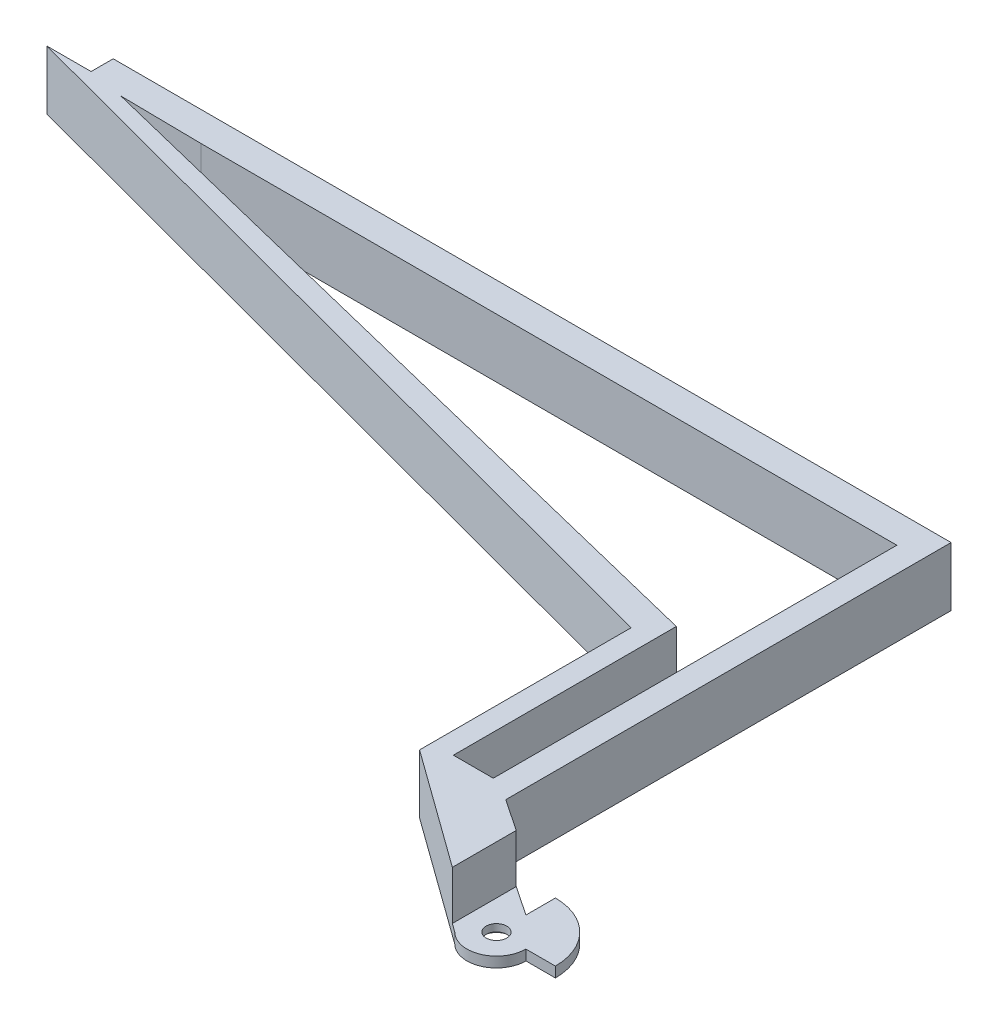
ISO-10303-21;
HEADER;
FILE_DESCRIPTION(('STEP AP214'),'2;1');
FILE_NAME('part.step','',(''),(''),'','','');
FILE_SCHEMA(('AUTOMOTIVE_DESIGN { 1 0 10303 214 1 1 1 1 }'));
ENDSEC;
DATA;
#1=APPLICATION_CONTEXT('core data for automotive mechanical design processes');
#2=APPLICATION_PROTOCOL_DEFINITION('international standard','automotive_design',2000,#1);
#3=PRODUCT_CONTEXT('',#1,'mechanical');
#4=PRODUCT('Part','Part','',(#3));
#5=PRODUCT_RELATED_PRODUCT_CATEGORY('part','',(#4));
#6=PRODUCT_DEFINITION_FORMATION('','',#4);
#7=PRODUCT_DEFINITION_CONTEXT('part definition',#1,'design');
#8=PRODUCT_DEFINITION('design','',#6,#7);
#9=PRODUCT_DEFINITION_SHAPE('','',#8);
#10=(LENGTH_UNIT() NAMED_UNIT(*) SI_UNIT(.MILLI.,.METRE.));
#11=(NAMED_UNIT(*) PLANE_ANGLE_UNIT() SI_UNIT($,.RADIAN.));
#12=(NAMED_UNIT(*) SI_UNIT($,.STERADIAN.) SOLID_ANGLE_UNIT());
#13=UNCERTAINTY_MEASURE_WITH_UNIT(LENGTH_MEASURE(1.E-05),#10,'distance_accuracy_value','');
#14=(GEOMETRIC_REPRESENTATION_CONTEXT(3) GLOBAL_UNCERTAINTY_ASSIGNED_CONTEXT((#13)) GLOBAL_UNIT_ASSIGNED_CONTEXT((#10,
#11,#12)) REPRESENTATION_CONTEXT('',''));
#15=CARTESIAN_POINT('',(0.,0.,0.));
#16=DIRECTION('',(0.,0.,1.));
#17=DIRECTION('',(1.,0.,0.));
#18=AXIS2_PLACEMENT_3D('',#15,#16,#17);
#19=CARTESIAN_POINT('',(0.,0.,0.));
#20=DIRECTION('',(0.,1.,0.));
#21=DIRECTION('',(0.,0.,1.));
#22=AXIS2_PLACEMENT_3D('',#19,#20,#21);
#23=PLANE('',#22);
#24=DIRECTION('',(0.,0.,1.));
#25=VECTOR('',#24,1.);
#26=CARTESIAN_POINT('',(-21.722634255886,0.,0.));
#27=LINE('',#26,#25);
#28=CARTESIAN_POINT('',(-21.722634255886,0.,-52.724086510522));
#29=VERTEX_POINT('',#28);
#30=CARTESIAN_POINT('',(-21.722634255886,0.,-14.302803384287));
#31=VERTEX_POINT('',#30);
#32=EDGE_CURVE('E241',#29,#31,#27,.T.);
#33=ORIENTED_EDGE('',*,*,#32,.T.);
#34=DIRECTION('',(1.,0.,0.));
#35=VECTOR('',#34,1.);
#36=CARTESIAN_POINT('',(0.,0.,-14.302803384287));
#37=LINE('',#36,#35);
#38=CARTESIAN_POINT('',(-14.8463419737858,0.,-14.302803384287));
#39=VERTEX_POINT('',#38);
#40=EDGE_CURVE('E220',#31,#39,#37,.T.);
#41=ORIENTED_EDGE('',*,*,#40,.T.);
#42=DIRECTION('',(0.,0.,-1.));
#43=VECTOR('',#42,1.);
#44=CARTESIAN_POINT('',(-14.8463419737858,0.,0.));
#45=LINE('',#44,#43);
#46=CARTESIAN_POINT('',(-14.8463419737858,0.,-83.8457667411095));
#47=VERTEX_POINT('',#46);
#48=EDGE_CURVE('E224',#39,#47,#45,.T.);
#49=ORIENTED_EDGE('',*,*,#48,.T.);
#50=DIRECTION('',(-1.,0.,0.));
#51=VECTOR('',#50,1.);
#52=CARTESIAN_POINT('',(0.,0.,-83.8457667411095));
#53=LINE('',#52,#51);
#54=CARTESIAN_POINT('',(-134.751688642909,0.,-83.8457667411095));
#55=VERTEX_POINT('',#54);
#56=EDGE_CURVE('E229',#47,#55,#53,.T.);
#57=ORIENTED_EDGE('',*,*,#56,.T.);
#58=DIRECTION('',(-0.999911696276324,0.,-0.0132890800962312));
#59=VECTOR('',#58,1.);
#60=CARTESIAN_POINT('',(1.09033761799503,0.,-82.0403917523599));
#61=LINE('',#60,#59);
#62=CARTESIAN_POINT('',(-148.742405448219,0.,-84.0317069165488));
#63=VERTEX_POINT('',#62);
#64=EDGE_CURVE('E233',#55,#63,#61,.T.);
#65=ORIENTED_EDGE('',*,*,#64,.T.);
#66=DIRECTION('',(0.970941713271439,0.,0.239316086859038));
#67=VECTOR('',#66,1.);
#68=CARTESIAN_POINT('',(11.0069698572224,0.,-44.6569485209475));
#69=LINE('',#68,#67);
#70=EDGE_CURVE('E237',#63,#29,#69,.T.);
#71=ORIENTED_EDGE('',*,*,#70,.T.);
#72=EDGE_LOOP('',(#33,#41,#49,#57,#65,#71));
#73=FACE_BOUND('',#72,.T.);
#74=DIRECTION('',(0.966424495370872,0.,0.256950763274125));
#75=VECTOR('',#74,1.);
#76=CARTESIAN_POINT('',(-25.4257667411095,0.,-48.6479755587739));
#77=LINE('',#76,#75);
#78=CARTESIAN_POINT('',(-162.585766741109,0.,-85.1157667411095));
#79=VERTEX_POINT('',#78);
#80=CARTESIAN_POINT('',(-25.4257667411095,0.,-48.6479755587739));
#81=VERTEX_POINT('',#80);
#82=EDGE_CURVE('E289',#79,#81,#77,.T.);
#83=ORIENTED_EDGE('',*,*,#82,.F.);
#84=DIRECTION('',(-1.,0.,0.));
#85=VECTOR('',#84,1.);
#86=CARTESIAN_POINT('',(-162.585766741109,0.,-85.1157667411095));
#87=LINE('',#86,#85);
#88=CARTESIAN_POINT('',(-154.965766741109,0.,-85.1157667411095));
#89=VERTEX_POINT('',#88);
#90=EDGE_CURVE('E298',#89,#79,#87,.T.);
#91=ORIENTED_EDGE('',*,*,#90,.F.);
#92=DIRECTION('',(0.,0.,1.));
#93=VECTOR('',#92,1.);
#94=CARTESIAN_POINT('',(-154.965766741109,0.,-85.1157667411095));
#95=LINE('',#94,#93);
#96=CARTESIAN_POINT('',(-154.965766741109,0.,-88.9257667411095));
#97=VERTEX_POINT('',#96);
#98=EDGE_CURVE('E355',#97,#89,#95,.T.);
#99=ORIENTED_EDGE('',*,*,#98,.F.);
#100=DIRECTION('',(-1.,0.,0.));
#101=VECTOR('',#100,1.);
#102=CARTESIAN_POINT('',(-154.965766741109,0.,-88.9257667411095));
#103=LINE('',#102,#101);
#104=CARTESIAN_POINT('',(-10.5729282133232,0.,-88.9257667411095));
#105=VERTEX_POINT('',#104);
#106=EDGE_CURVE('E352',#105,#97,#103,.T.);
#107=ORIENTED_EDGE('',*,*,#106,.F.);
#108=DIRECTION('',(0.,0.,-1.));
#109=VECTOR('',#108,1.);
#110=CARTESIAN_POINT('',(-10.5729282133232,0.,-12.1801843764384));
#111=LINE('',#110,#109);
#112=CARTESIAN_POINT('',(-10.5729282133232,0.,-12.1801843764384));
#113=VERTEX_POINT('',#112);
#114=EDGE_CURVE('E348',#113,#105,#111,.T.);
#115=ORIENTED_EDGE('',*,*,#114,.F.);
#116=DIRECTION('',(-0.830176857864615,0.,-0.5575001207767));
#117=VECTOR('',#116,1.);
#118=CARTESIAN_POINT('',(0.,0.,-5.08));
#119=LINE('',#118,#117);
#120=CARTESIAN_POINT('',(0.,0.,-5.08));
#121=VERTEX_POINT('',#120);
#122=EDGE_CURVE('E345',#121,#113,#119,.T.);
#123=ORIENTED_EDGE('',*,*,#122,.F.);
#124=DIRECTION('',(0.,0.,1.));
#125=VECTOR('',#124,1.);
#126=CARTESIAN_POINT('',(0.,0.,-5.08));
#127=LINE('',#126,#125);
#128=CARTESIAN_POINT('',(0.,0.,-10.16));
#129=VERTEX_POINT('',#128);
#130=EDGE_CURVE('E341',#129,#121,#127,.T.);
#131=ORIENTED_EDGE('',*,*,#130,.F.);
#132=CARTESIAN_POINT('',(0.,0.,0.));
#133=DIRECTION('',(0.,1.,0.));
#134=DIRECTION('',(0.,0.,1.));
#135=AXIS2_PLACEMENT_3D('',#132,#133,#134);
#136=CIRCLE('',#135,10.16);
#137=CARTESIAN_POINT('',(10.16,0.,0.));
#138=VERTEX_POINT('',#137);
#139=EDGE_CURVE('E337',#138,#129,#136,.T.);
#140=ORIENTED_EDGE('',*,*,#139,.F.);
#141=DIRECTION('',(1.,0.,0.));
#142=VECTOR('',#141,1.);
#143=CARTESIAN_POINT('',(5.08,0.,0.));
#144=LINE('',#143,#142);
#145=CARTESIAN_POINT('',(5.08,0.,0.));
#146=VERTEX_POINT('',#145);
#147=EDGE_CURVE('E333',#146,#138,#144,.T.);
#148=ORIENTED_EDGE('',*,*,#147,.F.);
#149=CARTESIAN_POINT('',(0.,0.,0.));
#150=DIRECTION('',(0.,1.,0.));
#151=DIRECTION('',(0.,0.,1.));
#152=AXIS2_PLACEMENT_3D('',#149,#150,#151);
#153=CIRCLE('',#152,5.08);
#154=CARTESIAN_POINT('',(-3.59210244842768,0.,3.59210244842764));
#155=VERTEX_POINT('',#154);
#156=EDGE_CURVE('E329',#155,#146,#153,.T.);
#157=ORIENTED_EDGE('',*,*,#156,.F.);
#158=DIRECTION('',(0.810617030445156,0.,0.585576664453321));
#159=VECTOR('',#158,1.);
#160=CARTESIAN_POINT('',(-3.59210244842768,0.,3.59210244842764));
#161=LINE('',#160,#159);
#162=CARTESIAN_POINT('',(-25.4257667411095,0.,-12.1801843764384));
#163=VERTEX_POINT('',#162);
#164=EDGE_CURVE('E326',#163,#155,#161,.T.);
#165=ORIENTED_EDGE('',*,*,#164,.F.);
#166=DIRECTION('',(0.,0.,1.));
#167=VECTOR('',#166,1.);
#168=CARTESIAN_POINT('',(-25.4257667411095,0.,-12.1801843764384));
#169=LINE('',#168,#167);
#170=EDGE_CURVE('E323',#81,#163,#169,.T.);
#171=ORIENTED_EDGE('',*,*,#170,.F.);
#172=EDGE_LOOP('',(#83,#91,#99,#107,#115,#123,#131,#140,#148,#157,#165,#171));
#173=FACE_BOUND('',#172,.T.);
#174=CARTESIAN_POINT('',(0.,0.,0.));
#175=DIRECTION('',(0.,-1.,0.));
#176=DIRECTION('',(0.,0.,-1.));
#177=AXIS2_PLACEMENT_3D('',#174,#175,#176);
#178=CIRCLE('',#177,2.421001);
#179=CARTESIAN_POINT('',(0.,0.,-2.421001));
#180=VERTEX_POINT('',#179);
#181=EDGE_CURVE('E189',#180,#180,#178,.T.);
#182=ORIENTED_EDGE('',*,*,#181,.F.);
#183=EDGE_LOOP('',(#182));
#184=FACE_BOUND('',#183,.T.);
#185=ADVANCED_FACE('F41',(#73,#173,#184),#23,.F.);
#186=CARTESIAN_POINT('',(-25.4257667411095,10.16,-48.6479755587739));
#187=DIRECTION('',(0.256950763274125,0.,-0.966424495370872));
#188=DIRECTION('',(-0.966424495370872,0.,-0.256950763274125));
#189=AXIS2_PLACEMENT_3D('',#186,#187,#188);
#190=PLANE('',#189);
#191=ORIENTED_EDGE('',*,*,#82,.T.);
#192=DIRECTION('',(0.,-1.,0.));
#193=VECTOR('',#192,1.);
#194=CARTESIAN_POINT('',(-25.4257667411095,10.16,-48.6479755587739));
#195=LINE('',#194,#193);
#196=CARTESIAN_POINT('',(-25.4257667411095,10.16,-48.6479755587739));
#197=VERTEX_POINT('',#196);
#198=EDGE_CURVE('E11',#197,#81,#195,.T.);
#199=ORIENTED_EDGE('',*,*,#198,.F.);
#200=DIRECTION('',(0.966424495370872,0.,0.256950763274125));
#201=VECTOR('',#200,1.);
#202=CARTESIAN_POINT('',(-25.4257667411095,10.16,-48.6479755587739));
#203=LINE('',#202,#201);
#204=CARTESIAN_POINT('',(-162.585766741109,10.16,-85.1157667411095));
#205=VERTEX_POINT('',#204);
#206=EDGE_CURVE('E293',#205,#197,#203,.T.);
#207=ORIENTED_EDGE('',*,*,#206,.F.);
#208=DIRECTION('',(0.,-1.,0.));
#209=VECTOR('',#208,1.);
#210=CARTESIAN_POINT('',(-162.585766741109,10.16,-85.1157667411095));
#211=LINE('',#210,#209);
#212=EDGE_CURVE('E319',#205,#79,#211,.T.);
#213=ORIENTED_EDGE('',*,*,#212,.T.);
#214=EDGE_LOOP('',(#191,#199,#207,#213));
#215=FACE_BOUND('',#214,.T.);
#216=ADVANCED_FACE('F43',(#215),#190,.F.);
#217=CARTESIAN_POINT('',(-25.4257667411095,10.16,-12.1801843764384));
#218=DIRECTION('',(1.,0.,0.));
#219=DIRECTION('',(0.,0.,-1.));
#220=AXIS2_PLACEMENT_3D('',#217,#218,#219);
#221=PLANE('',#220);
#222=ORIENTED_EDGE('',*,*,#170,.T.);
#223=DIRECTION('',(0.,-1.,0.));
#224=VECTOR('',#223,1.);
#225=CARTESIAN_POINT('',(-25.4257667411095,10.16,-12.1801843764384));
#226=LINE('',#225,#224);
#227=CARTESIAN_POINT('',(-25.4257667411095,10.16,-12.1801843764384));
#228=VERTEX_POINT('',#227);
#229=EDGE_CURVE('E51',#228,#163,#226,.T.);
#230=ORIENTED_EDGE('',*,*,#229,.F.);
#231=DIRECTION('',(0.,0.,1.));
#232=VECTOR('',#231,1.);
#233=CARTESIAN_POINT('',(-25.4257667411095,10.16,-12.1801843764384));
#234=LINE('',#233,#232);
#235=EDGE_CURVE('E297',#197,#228,#234,.T.);
#236=ORIENTED_EDGE('',*,*,#235,.F.);
#237=ORIENTED_EDGE('',*,*,#198,.T.);
#238=EDGE_LOOP('',(#222,#230,#236,#237));
#239=FACE_BOUND('',#238,.T.);
#240=ADVANCED_FACE('F447',(#239),#221,.F.);
#241=CARTESIAN_POINT('',(-3.59210244842768,10.16,3.59210244842764));
#242=DIRECTION('',(0.585576664453321,0.,-0.810617030445156));
#243=DIRECTION('',(-0.810617030445156,0.,-0.585576664453321));
#244=AXIS2_PLACEMENT_3D('',#241,#242,#243);
#245=PLANE('',#244);
#246=DIRECTION('',(-0.810617030445156,0.,-0.585576664453321));
#247=VECTOR('',#246,1.);
#248=CARTESIAN_POINT('',(-3.59210244842768,1.778,3.59210244842764));
#249=LINE('',#248,#247);
#250=CARTESIAN_POINT('',(-3.59210244842768,1.778,3.59210244842764));
#251=VERTEX_POINT('',#250);
#252=CARTESIAN_POINT('',(-5.08,1.778,2.51726926262656));
#253=VERTEX_POINT('',#252);
#254=EDGE_CURVE('E193',#251,#253,#249,.T.);
#255=ORIENTED_EDGE('',*,*,#254,.T.);
#256=DIRECTION('',(0.,1.,0.));
#257=VECTOR('',#256,1.);
#258=CARTESIAN_POINT('',(-5.08,10.16,2.51726926262656));
#259=LINE('',#258,#257);
#260=CARTESIAN_POINT('',(-5.08,10.16,2.51726926262656));
#261=VERTEX_POINT('',#260);
#262=EDGE_CURVE('E179',#253,#261,#259,.T.);
#263=ORIENTED_EDGE('',*,*,#262,.T.);
#264=DIRECTION('',(0.810617030445156,0.,0.585576664453321));
#265=VECTOR('',#264,1.);
#266=CARTESIAN_POINT('',(-3.59210244842768,10.16,3.59210244842764));
#267=LINE('',#266,#265);
#268=EDGE_CURVE('E301',#228,#261,#267,.T.);
#269=ORIENTED_EDGE('',*,*,#268,.F.);
#270=ORIENTED_EDGE('',*,*,#229,.T.);
#271=ORIENTED_EDGE('',*,*,#164,.T.);
#272=DIRECTION('',(0.,-1.,0.));
#273=VECTOR('',#272,1.);
#274=CARTESIAN_POINT('',(-3.59210244842768,10.16,3.59210244842764));
#275=LINE('',#274,#273);
#276=EDGE_CURVE('E202',#251,#155,#275,.T.);
#277=ORIENTED_EDGE('',*,*,#276,.F.);
#278=EDGE_LOOP('',(#255,#263,#269,#270,#271,#277));
#279=FACE_BOUND('',#278,.T.);
#280=ADVANCED_FACE('F200',(#279),#245,.F.);
#281=CARTESIAN_POINT('',(0.,10.16,0.));
#282=DIRECTION('',(0.,-1.,0.));
#283=DIRECTION('',(0.,0.,-1.));
#284=AXIS2_PLACEMENT_3D('',#281,#282,#283);
#285=CYLINDRICAL_SURFACE('',#284,5.08);
#286=DIRECTION('',(0.,-1.,0.));
#287=VECTOR('',#286,1.);
#288=CARTESIAN_POINT('',(5.08,10.16,0.));
#289=LINE('',#288,#287);
#290=CARTESIAN_POINT('',(5.08,1.778,0.));
#291=VERTEX_POINT('',#290);
#292=EDGE_CURVE('E388',#291,#146,#289,.T.);
#293=ORIENTED_EDGE('',*,*,#292,.F.);
#294=CARTESIAN_POINT('',(0.,1.778,0.));
#295=DIRECTION('',(0.,-1.,0.));
#296=DIRECTION('',(0.,0.,-1.));
#297=AXIS2_PLACEMENT_3D('',#294,#295,#296);
#298=CIRCLE('',#297,5.08);
#299=EDGE_CURVE('E204',#291,#251,#298,.T.);
#300=ORIENTED_EDGE('',*,*,#299,.T.);
#301=ORIENTED_EDGE('',*,*,#276,.T.);
#302=ORIENTED_EDGE('',*,*,#156,.T.);
#303=EDGE_LOOP('',(#293,#300,#301,#302));
#304=FACE_BOUND('',#303,.T.);
#305=ADVANCED_FACE('F406',(#304),#285,.T.);
#306=CARTESIAN_POINT('',(5.08,10.16,0.));
#307=DIRECTION('',(0.,0.,-1.));
#308=DIRECTION('',(-1.,0.,0.));
#309=AXIS2_PLACEMENT_3D('',#306,#307,#308);
#310=PLANE('',#309);
#311=DIRECTION('',(0.,-1.,0.));
#312=VECTOR('',#311,1.);
#313=CARTESIAN_POINT('',(10.16,10.16,0.));
#314=LINE('',#313,#312);
#315=CARTESIAN_POINT('',(10.16,1.778,0.));
#316=VERTEX_POINT('',#315);
#317=EDGE_CURVE('E385',#316,#138,#314,.T.);
#318=ORIENTED_EDGE('',*,*,#317,.F.);
#319=DIRECTION('',(-1.,0.,0.));
#320=VECTOR('',#319,1.);
#321=CARTESIAN_POINT('',(5.08,1.778,0.));
#322=LINE('',#321,#320);
#323=EDGE_CURVE('E209',#316,#291,#322,.T.);
#324=ORIENTED_EDGE('',*,*,#323,.T.);
#325=ORIENTED_EDGE('',*,*,#292,.T.);
#326=ORIENTED_EDGE('',*,*,#147,.T.);
#327=EDGE_LOOP('',(#318,#324,#325,#326));
#328=FACE_BOUND('',#327,.T.);
#329=ADVANCED_FACE('F411',(#328),#310,.F.);
#330=CARTESIAN_POINT('',(0.,10.16,0.));
#331=DIRECTION('',(0.,-1.,0.));
#332=DIRECTION('',(0.,0.,-1.));
#333=AXIS2_PLACEMENT_3D('',#330,#331,#332);
#334=CYLINDRICAL_SURFACE('',#333,10.16);
#335=DIRECTION('',(0.,-1.,0.));
#336=VECTOR('',#335,1.);
#337=CARTESIAN_POINT('',(0.,10.16,-10.16));
#338=LINE('',#337,#336);
#339=CARTESIAN_POINT('',(0.,1.778,-10.16));
#340=VERTEX_POINT('',#339);
#341=EDGE_CURVE('E382',#340,#129,#338,.T.);
#342=ORIENTED_EDGE('',*,*,#341,.F.);
#343=CARTESIAN_POINT('',(0.,1.778,0.));
#344=DIRECTION('',(0.,-1.,0.));
#345=DIRECTION('',(0.,0.,-1.));
#346=AXIS2_PLACEMENT_3D('',#343,#344,#345);
#347=CIRCLE('',#346,10.16);
#348=EDGE_CURVE('E413',#340,#316,#347,.T.);
#349=ORIENTED_EDGE('',*,*,#348,.T.);
#350=ORIENTED_EDGE('',*,*,#317,.T.);
#351=ORIENTED_EDGE('',*,*,#139,.T.);
#352=EDGE_LOOP('',(#342,#349,#350,#351));
#353=FACE_BOUND('',#352,.T.);
#354=ADVANCED_FACE('F476',(#353),#334,.T.);
#355=CARTESIAN_POINT('',(0.,10.16,-5.08));
#356=DIRECTION('',(1.,0.,0.));
#357=DIRECTION('',(0.,0.,-1.));
#358=AXIS2_PLACEMENT_3D('',#355,#356,#357);
#359=PLANE('',#358);
#360=DIRECTION('',(0.,-1.,0.));
#361=VECTOR('',#360,1.);
#362=CARTESIAN_POINT('',(0.,10.16,-5.08));
#363=LINE('',#362,#361);
#364=CARTESIAN_POINT('',(0.,1.778,-5.08));
#365=VERTEX_POINT('',#364);
#366=EDGE_CURVE('E379',#365,#121,#363,.T.);
#367=ORIENTED_EDGE('',*,*,#366,.F.);
#368=DIRECTION('',(0.,0.,-1.));
#369=VECTOR('',#368,1.);
#370=CARTESIAN_POINT('',(0.,1.778,-5.08));
#371=LINE('',#370,#369);
#372=EDGE_CURVE('E415',#365,#340,#371,.T.);
#373=ORIENTED_EDGE('',*,*,#372,.T.);
#374=ORIENTED_EDGE('',*,*,#341,.T.);
#375=ORIENTED_EDGE('',*,*,#130,.T.);
#376=EDGE_LOOP('',(#367,#373,#374,#375));
#377=FACE_BOUND('',#376,.T.);
#378=ADVANCED_FACE('F472',(#377),#359,.F.);
#379=CARTESIAN_POINT('',(0.,10.16,-5.08));
#380=DIRECTION('',(-0.5575001207767,0.,0.830176857864615));
#381=DIRECTION('',(0.830176857864615,0.,0.5575001207767));
#382=AXIS2_PLACEMENT_3D('',#379,#380,#381);
#383=PLANE('',#382);
#384=DIRECTION('',(-0.830176857864615,0.,-0.5575001207767));
#385=VECTOR('',#384,1.);
#386=CARTESIAN_POINT('',(0.,10.16,-5.08));
#387=LINE('',#386,#385);
#388=CARTESIAN_POINT('',(-5.08,10.16,-8.49144249772317));
#389=VERTEX_POINT('',#388);
#390=CARTESIAN_POINT('',(-10.5729282133232,10.16,-12.1801843764384));
#391=VERTEX_POINT('',#390);
#392=EDGE_CURVE('E304',#389,#391,#387,.T.);
#393=ORIENTED_EDGE('',*,*,#392,.F.);
#394=DIRECTION('',(0.,-1.,0.));
#395=VECTOR('',#394,1.);
#396=CARTESIAN_POINT('',(-5.08,10.16,-8.49144249772317));
#397=LINE('',#396,#395);
#398=CARTESIAN_POINT('',(-5.08,1.778,-8.49144249772317));
#399=VERTEX_POINT('',#398);
#400=EDGE_CURVE('E58',#389,#399,#397,.T.);
#401=ORIENTED_EDGE('',*,*,#400,.T.);
#402=DIRECTION('',(0.830176857864615,0.,0.5575001207767));
#403=VECTOR('',#402,1.);
#404=CARTESIAN_POINT('',(0.,1.778,-5.08));
#405=LINE('',#404,#403);
#406=EDGE_CURVE('E196',#399,#365,#405,.T.);
#407=ORIENTED_EDGE('',*,*,#406,.T.);
#408=ORIENTED_EDGE('',*,*,#366,.T.);
#409=ORIENTED_EDGE('',*,*,#122,.T.);
#410=DIRECTION('',(0.,-1.,0.));
#411=VECTOR('',#410,1.);
#412=CARTESIAN_POINT('',(-10.5729282133232,10.16,-12.1801843764384));
#413=LINE('',#412,#411);
#414=EDGE_CURVE('E375',#391,#113,#413,.T.);
#415=ORIENTED_EDGE('',*,*,#414,.F.);
#416=EDGE_LOOP('',(#393,#401,#407,#408,#409,#415));
#417=FACE_BOUND('',#416,.T.);
#418=ADVANCED_FACE('F468',(#417),#383,.F.);
#419=CARTESIAN_POINT('',(-10.5729282133232,10.16,-12.1801843764384));
#420=DIRECTION('',(-1.,0.,0.));
#421=DIRECTION('',(0.,0.,1.));
#422=AXIS2_PLACEMENT_3D('',#419,#420,#421);
#423=PLANE('',#422);
#424=ORIENTED_EDGE('',*,*,#114,.T.);
#425=DIRECTION('',(0.,-1.,0.));
#426=VECTOR('',#425,1.);
#427=CARTESIAN_POINT('',(-10.5729282133232,10.16,-88.9257667411095));
#428=LINE('',#427,#426);
#429=CARTESIAN_POINT('',(-10.5729282133232,10.16,-88.9257667411095));
#430=VERTEX_POINT('',#429);
#431=EDGE_CURVE('E371',#430,#105,#428,.T.);
#432=ORIENTED_EDGE('',*,*,#431,.F.);
#433=DIRECTION('',(0.,0.,-1.));
#434=VECTOR('',#433,1.);
#435=CARTESIAN_POINT('',(-10.5729282133232,10.16,-12.1801843764384));
#436=LINE('',#435,#434);
#437=EDGE_CURVE('E307',#391,#430,#436,.T.);
#438=ORIENTED_EDGE('',*,*,#437,.F.);
#439=ORIENTED_EDGE('',*,*,#414,.T.);
#440=EDGE_LOOP('',(#424,#432,#438,#439));
#441=FACE_BOUND('',#440,.T.);
#442=ADVANCED_FACE('F464',(#441),#423,.F.);
#443=CARTESIAN_POINT('',(-154.965766741109,10.16,-88.9257667411095));
#444=DIRECTION('',(0.,0.,1.));
#445=DIRECTION('',(1.,0.,0.));
#446=AXIS2_PLACEMENT_3D('',#443,#444,#445);
#447=PLANE('',#446);
#448=CARTESIAN_POINT('',(-82.7693474772163,5.08,-88.9257667411095));
#449=DIRECTION('',(0.,0.,-1.));
#450=DIRECTION('',(-1.,0.,0.));
#451=AXIS2_PLACEMENT_3D('',#448,#449,#450);
#452=CIRCLE('',#451,2.54);
#453=CARTESIAN_POINT('',(-85.3093474772163,5.08,-88.9257667411095));
#454=VERTEX_POINT('',#453);
#455=EDGE_CURVE('E270',#454,#454,#452,.T.);
#456=ORIENTED_EDGE('',*,*,#455,.F.);
#457=EDGE_LOOP('',(#456));
#458=FACE_BOUND('',#457,.T.);
#459=ORIENTED_EDGE('',*,*,#106,.T.);
#460=DIRECTION('',(0.,-1.,0.));
#461=VECTOR('',#460,1.);
#462=CARTESIAN_POINT('',(-154.965766741109,10.16,-88.9257667411095));
#463=LINE('',#462,#461);
#464=CARTESIAN_POINT('',(-154.965766741109,10.16,-88.9257667411095));
#465=VERTEX_POINT('',#464);
#466=EDGE_CURVE('E367',#465,#97,#463,.T.);
#467=ORIENTED_EDGE('',*,*,#466,.F.);
#468=DIRECTION('',(-1.,0.,0.));
#469=VECTOR('',#468,1.);
#470=CARTESIAN_POINT('',(-33.0457667411095,10.16,-88.9257667411095));
#471=LINE('',#470,#469);
#472=EDGE_CURVE('E310',#430,#465,#471,.T.);
#473=ORIENTED_EDGE('',*,*,#472,.F.);
#474=ORIENTED_EDGE('',*,*,#431,.T.);
#475=EDGE_LOOP('',(#459,#467,#473,#474));
#476=FACE_BOUND('',#475,.T.);
#477=ADVANCED_FACE('F460',(#458,#476),#447,.F.);
#478=CARTESIAN_POINT('',(-154.965766741109,10.16,-85.1157667411095));
#479=DIRECTION('',(1.,0.,0.));
#480=DIRECTION('',(0.,0.,-1.));
#481=AXIS2_PLACEMENT_3D('',#478,#479,#480);
#482=PLANE('',#481);
#483=ORIENTED_EDGE('',*,*,#98,.T.);
#484=DIRECTION('',(0.,-1.,0.));
#485=VECTOR('',#484,1.);
#486=CARTESIAN_POINT('',(-154.965766741109,10.16,-85.1157667411095));
#487=LINE('',#486,#485);
#488=CARTESIAN_POINT('',(-154.965766741109,10.16,-85.1157667411095));
#489=VERTEX_POINT('',#488);
#490=EDGE_CURVE('E363',#489,#89,#487,.T.);
#491=ORIENTED_EDGE('',*,*,#490,.F.);
#492=DIRECTION('',(0.,0.,1.));
#493=VECTOR('',#492,1.);
#494=CARTESIAN_POINT('',(-154.965766741109,10.16,-85.1157667411095));
#495=LINE('',#494,#493);
#496=EDGE_CURVE('E313',#465,#489,#495,.T.);
#497=ORIENTED_EDGE('',*,*,#496,.F.);
#498=ORIENTED_EDGE('',*,*,#466,.T.);
#499=EDGE_LOOP('',(#483,#491,#497,#498));
#500=FACE_BOUND('',#499,.T.);
#501=ADVANCED_FACE('F456',(#500),#482,.F.);
#502=CARTESIAN_POINT('',(-162.585766741109,10.16,-85.1157667411095));
#503=DIRECTION('',(0.,0.,1.));
#504=DIRECTION('',(1.,0.,0.));
#505=AXIS2_PLACEMENT_3D('',#502,#503,#504);
#506=PLANE('',#505);
#507=ORIENTED_EDGE('',*,*,#90,.T.);
#508=ORIENTED_EDGE('',*,*,#212,.F.);
#509=DIRECTION('',(-1.,0.,0.));
#510=VECTOR('',#509,1.);
#511=CARTESIAN_POINT('',(-162.585766741109,10.16,-85.1157667411095));
#512=LINE('',#511,#510);
#513=EDGE_CURVE('E316',#489,#205,#512,.T.);
#514=ORIENTED_EDGE('',*,*,#513,.F.);
#515=ORIENTED_EDGE('',*,*,#490,.T.);
#516=EDGE_LOOP('',(#507,#508,#514,#515));
#517=FACE_BOUND('',#516,.T.);
#518=ADVANCED_FACE('F453',(#517),#506,.F.);
#519=CARTESIAN_POINT('',(0.,10.16,0.));
#520=DIRECTION('',(0.,1.,0.));
#521=DIRECTION('',(0.,0.,1.));
#522=AXIS2_PLACEMENT_3D('',#519,#520,#521);
#523=PLANE('',#522);
#524=DIRECTION('',(0.,0.,-1.));
#525=VECTOR('',#524,1.);
#526=CARTESIAN_POINT('',(-5.08,10.16,5.08));
#527=LINE('',#526,#525);
#528=EDGE_CURVE('E183',#261,#389,#527,.T.);
#529=ORIENTED_EDGE('',*,*,#528,.T.);
#530=ORIENTED_EDGE('',*,*,#392,.T.);
#531=ORIENTED_EDGE('',*,*,#437,.T.);
#532=ORIENTED_EDGE('',*,*,#472,.T.);
#533=ORIENTED_EDGE('',*,*,#496,.T.);
#534=ORIENTED_EDGE('',*,*,#513,.T.);
#535=ORIENTED_EDGE('',*,*,#206,.T.);
#536=ORIENTED_EDGE('',*,*,#235,.T.);
#537=ORIENTED_EDGE('',*,*,#268,.T.);
#538=EDGE_LOOP('',(#529,#530,#531,#532,#533,#534,#535,#536,#537));
#539=FACE_BOUND('',#538,.T.);
#540=DIRECTION('',(1.,0.,0.));
#541=VECTOR('',#540,1.);
#542=CARTESIAN_POINT('',(0.,10.16,-14.302803384287));
#543=LINE('',#542,#541);
#544=CARTESIAN_POINT('',(-21.722634255886,10.16,-14.302803384287));
#545=VERTEX_POINT('',#544);
#546=CARTESIAN_POINT('',(-14.8463419737858,10.16,-14.302803384287));
#547=VERTEX_POINT('',#546);
#548=EDGE_CURVE('E66',#545,#547,#543,.T.);
#549=ORIENTED_EDGE('',*,*,#548,.F.);
#550=DIRECTION('',(0.,0.,1.));
#551=VECTOR('',#550,1.);
#552=CARTESIAN_POINT('',(-21.722634255886,10.16,0.));
#553=LINE('',#552,#551);
#554=CARTESIAN_POINT('',(-21.722634255886,10.16,-52.724086510522));
#555=VERTEX_POINT('',#554);
#556=EDGE_CURVE('E225',#555,#545,#553,.T.);
#557=ORIENTED_EDGE('',*,*,#556,.F.);
#558=DIRECTION('',(0.970941713271439,0.,0.239316086859038));
#559=VECTOR('',#558,1.);
#560=CARTESIAN_POINT('',(11.0069698572224,10.16,-44.6569485209475));
#561=LINE('',#560,#559);
#562=CARTESIAN_POINT('',(-148.742405448219,10.16,-84.0317069165488));
#563=VERTEX_POINT('',#562);
#564=EDGE_CURVE('E260',#563,#555,#561,.T.);
#565=ORIENTED_EDGE('',*,*,#564,.F.);
#566=DIRECTION('',(-0.999911696276324,0.,-0.0132890800962312));
#567=VECTOR('',#566,1.);
#568=CARTESIAN_POINT('',(1.09033761799503,10.16,-82.0403917523599));
#569=LINE('',#568,#567);
#570=CARTESIAN_POINT('',(-134.751688642909,10.16,-83.8457667411095));
#571=VERTEX_POINT('',#570);
#572=EDGE_CURVE('E256',#571,#563,#569,.T.);
#573=ORIENTED_EDGE('',*,*,#572,.F.);
#574=DIRECTION('',(-1.,0.,0.));
#575=VECTOR('',#574,1.);
#576=CARTESIAN_POINT('',(0.,10.16,-83.8457667411095));
#577=LINE('',#576,#575);
#578=CARTESIAN_POINT('',(-14.8463419737858,10.16,-83.8457667411095));
#579=VERTEX_POINT('',#578);
#580=EDGE_CURVE('E252',#579,#571,#577,.T.);
#581=ORIENTED_EDGE('',*,*,#580,.F.);
#582=DIRECTION('',(0.,0.,-1.));
#583=VECTOR('',#582,1.);
#584=CARTESIAN_POINT('',(-14.8463419737858,10.16,0.));
#585=LINE('',#584,#583);
#586=EDGE_CURVE('E248',#547,#579,#585,.T.);
#587=ORIENTED_EDGE('',*,*,#586,.F.);
#588=EDGE_LOOP('',(#549,#557,#565,#573,#581,#587));
#589=FACE_BOUND('',#588,.T.);
#590=ADVANCED_FACE('F451',(#539,#589),#523,.T.);
#591=CARTESIAN_POINT('',(-82.7693474772163,5.08,-86.3857667411095));
#592=DIRECTION('',(0.,0.,-1.));
#593=DIRECTION('',(-1.,0.,0.));
#594=AXIS2_PLACEMENT_3D('',#591,#592,#593);
#595=CYLINDRICAL_SURFACE('',#594,2.54);
#596=CARTESIAN_POINT('',(-82.7693474772163,5.08,-86.3857667411095));
#597=DIRECTION('',(0.,0.,-1.));
#598=DIRECTION('',(-1.,0.,0.));
#599=AXIS2_PLACEMENT_3D('',#596,#597,#598);
#600=CIRCLE('',#599,2.54);
#601=CARTESIAN_POINT('',(-85.3093474772163,5.08,-86.3857667411095));
#602=VERTEX_POINT('',#601);
#603=EDGE_CURVE('E285',#602,#602,#600,.T.);
#604=ORIENTED_EDGE('',*,*,#603,.F.);
#605=EDGE_LOOP('',(#604));
#606=FACE_BOUND('',#605,.T.);
#607=ORIENTED_EDGE('',*,*,#455,.T.);
#608=EDGE_LOOP('',(#607));
#609=FACE_BOUND('',#608,.T.);
#610=ADVANCED_FACE('F510',(#606,#609),#595,.F.);
#611=CARTESIAN_POINT('',(-82.7693474772163,5.08,-86.3857667411095));
#612=DIRECTION('',(0.,0.,-1.));
#613=DIRECTION('',(-1.,0.,0.));
#614=AXIS2_PLACEMENT_3D('',#611,#612,#613);
#615=PLANE('',#614);
#616=ORIENTED_EDGE('',*,*,#603,.T.);
#617=EDGE_LOOP('',(#616));
#618=FACE_BOUND('',#617,.T.);
#619=ADVANCED_FACE('F545',(#618),#615,.T.);
#620=CARTESIAN_POINT('',(0.,0.,-14.302803384287));
#621=DIRECTION('',(0.,0.,1.));
#622=DIRECTION('',(1.,0.,0.));
#623=AXIS2_PLACEMENT_3D('',#620,#621,#622);
#624=PLANE('',#623);
#625=ORIENTED_EDGE('',*,*,#548,.T.);
#626=DIRECTION('',(0.,1.,0.));
#627=VECTOR('',#626,1.);
#628=CARTESIAN_POINT('',(-14.8463419737858,0.,-14.302803384287));
#629=LINE('',#628,#627);
#630=EDGE_CURVE('E245',#39,#547,#629,.T.);
#631=ORIENTED_EDGE('',*,*,#630,.F.);
#632=ORIENTED_EDGE('',*,*,#40,.F.);
#633=DIRECTION('',(0.,1.,0.));
#634=VECTOR('',#633,1.);
#635=CARTESIAN_POINT('',(-21.722634255886,0.,-14.302803384287));
#636=LINE('',#635,#634);
#637=EDGE_CURVE('E267',#31,#545,#636,.T.);
#638=ORIENTED_EDGE('',*,*,#637,.T.);
#639=EDGE_LOOP('',(#625,#631,#632,#638));
#640=FACE_BOUND('',#639,.T.);
#641=ADVANCED_FACE('F521',(#640),#624,.F.);
#642=CARTESIAN_POINT('',(-21.722634255886,0.,0.));
#643=DIRECTION('',(-1.,0.,0.));
#644=DIRECTION('',(0.,0.,1.));
#645=AXIS2_PLACEMENT_3D('',#642,#643,#644);
#646=PLANE('',#645);
#647=ORIENTED_EDGE('',*,*,#556,.T.);
#648=ORIENTED_EDGE('',*,*,#637,.F.);
#649=ORIENTED_EDGE('',*,*,#32,.F.);
#650=DIRECTION('',(0.,1.,0.));
#651=VECTOR('',#650,1.);
#652=CARTESIAN_POINT('',(-21.722634255886,0.,-52.724086510522));
#653=LINE('',#652,#651);
#654=EDGE_CURVE('E271',#29,#555,#653,.T.);
#655=ORIENTED_EDGE('',*,*,#654,.T.);
#656=EDGE_LOOP('',(#647,#648,#649,#655));
#657=FACE_BOUND('',#656,.T.);
#658=ADVANCED_FACE('F525',(#657),#646,.F.);
#659=CARTESIAN_POINT('',(11.0069698572224,0.,-44.6569485209475));
#660=DIRECTION('',(-0.239316086859038,0.,0.970941713271439));
#661=DIRECTION('',(0.970941713271439,0.,0.239316086859038));
#662=AXIS2_PLACEMENT_3D('',#659,#660,#661);
#663=PLANE('',#662);
#664=ORIENTED_EDGE('',*,*,#564,.T.);
#665=ORIENTED_EDGE('',*,*,#654,.F.);
#666=ORIENTED_EDGE('',*,*,#70,.F.);
#667=DIRECTION('',(0.,1.,0.));
#668=VECTOR('',#667,1.);
#669=CARTESIAN_POINT('',(-148.742405448219,0.,-84.0317069165488));
#670=LINE('',#669,#668);
#671=EDGE_CURVE('E274',#63,#563,#670,.T.);
#672=ORIENTED_EDGE('',*,*,#671,.T.);
#673=EDGE_LOOP('',(#664,#665,#666,#672));
#674=FACE_BOUND('',#673,.T.);
#675=ADVANCED_FACE('F527',(#674),#663,.F.);
#676=CARTESIAN_POINT('',(1.09033761799503,0.,-82.0403917523599));
#677=DIRECTION('',(0.0132890800962312,0.,-0.999911696276324));
#678=DIRECTION('',(-0.999911696276324,0.,-0.0132890800962312));
#679=AXIS2_PLACEMENT_3D('',#676,#677,#678);
#680=PLANE('',#679);
#681=ORIENTED_EDGE('',*,*,#572,.T.);
#682=ORIENTED_EDGE('',*,*,#671,.F.);
#683=ORIENTED_EDGE('',*,*,#64,.F.);
#684=DIRECTION('',(0.,1.,0.));
#685=VECTOR('',#684,1.);
#686=CARTESIAN_POINT('',(-134.751688642909,0.,-83.8457667411095));
#687=LINE('',#686,#685);
#688=EDGE_CURVE('E277',#55,#571,#687,.T.);
#689=ORIENTED_EDGE('',*,*,#688,.T.);
#690=EDGE_LOOP('',(#681,#682,#683,#689));
#691=FACE_BOUND('',#690,.T.);
#692=ADVANCED_FACE('F529',(#691),#680,.F.);
#693=CARTESIAN_POINT('',(0.,0.,-83.8457667411095));
#694=DIRECTION('',(0.,0.,-1.));
#695=DIRECTION('',(-1.,0.,0.));
#696=AXIS2_PLACEMENT_3D('',#693,#694,#695);
#697=PLANE('',#696);
#698=ORIENTED_EDGE('',*,*,#580,.T.);
#699=ORIENTED_EDGE('',*,*,#688,.F.);
#700=ORIENTED_EDGE('',*,*,#56,.F.);
#701=DIRECTION('',(0.,1.,0.));
#702=VECTOR('',#701,1.);
#703=CARTESIAN_POINT('',(-14.8463419737858,0.,-83.8457667411095));
#704=LINE('',#703,#702);
#705=EDGE_CURVE('E280',#47,#579,#704,.T.);
#706=ORIENTED_EDGE('',*,*,#705,.T.);
#707=EDGE_LOOP('',(#698,#699,#700,#706));
#708=FACE_BOUND('',#707,.T.);
#709=ADVANCED_FACE('F532',(#708),#697,.F.);
#710=CARTESIAN_POINT('',(-14.8463419737858,0.,0.));
#711=DIRECTION('',(1.,0.,0.));
#712=DIRECTION('',(0.,0.,-1.));
#713=AXIS2_PLACEMENT_3D('',#710,#711,#712);
#714=PLANE('',#713);
#715=ORIENTED_EDGE('',*,*,#586,.T.);
#716=ORIENTED_EDGE('',*,*,#705,.F.);
#717=ORIENTED_EDGE('',*,*,#48,.F.);
#718=ORIENTED_EDGE('',*,*,#630,.T.);
#719=EDGE_LOOP('',(#715,#716,#717,#718));
#720=FACE_BOUND('',#719,.T.);
#721=ADVANCED_FACE('F518',(#720),#714,.F.);
#722=CARTESIAN_POINT('',(0.,0.,0.));
#723=DIRECTION('',(0.,-1.,0.));
#724=DIRECTION('',(0.,0.,-1.));
#725=AXIS2_PLACEMENT_3D('',#722,#723,#724);
#726=CYLINDRICAL_SURFACE('',#725,1.78600099999999);
#727=CARTESIAN_POINT('',(0.,1.778,0.));
#728=DIRECTION('',(0.,-1.,0.));
#729=DIRECTION('',(0.,0.,-1.));
#730=AXIS2_PLACEMENT_3D('',#727,#728,#729);
#731=CIRCLE('',#730,1.78600099999999);
#732=CARTESIAN_POINT('',(0.,1.778,-1.78600099999999));
#733=VERTEX_POINT('',#732);
#734=EDGE_CURVE('E45',#733,#733,#731,.F.);
#735=ORIENTED_EDGE('',*,*,#734,.T.);
#736=EDGE_LOOP('',(#735));
#737=FACE_BOUND('',#736,.T.);
#738=CARTESIAN_POINT('',(0.,0.532828265797577,0.));
#739=DIRECTION('',(0.,-1.,0.));
#740=DIRECTION('',(0.,0.,-1.));
#741=AXIS2_PLACEMENT_3D('',#738,#739,#740);
#742=CIRCLE('',#741,1.78600099999999);
#743=CARTESIAN_POINT('',(0.,0.532828265797577,-1.78600099999999));
#744=VERTEX_POINT('',#743);
#745=EDGE_CURVE('E216',#744,#744,#742,.T.);
#746=ORIENTED_EDGE('',*,*,#745,.T.);
#747=EDGE_LOOP('',(#746));
#748=FACE_BOUND('',#747,.T.);
#749=ADVANCED_FACE('F430',(#737,#748),#726,.F.);
#750=CARTESIAN_POINT('',(0.,0.,0.));
#751=DIRECTION('',(0.,-1.,0.));
#752=DIRECTION('',(0.,0.,-1.));
#753=AXIS2_PLACEMENT_3D('',#750,#751,#752);
#754=CONICAL_SURFACE('',#753,2.421001,0.872664625997167);
#755=ORIENTED_EDGE('',*,*,#745,.F.);
#756=EDGE_LOOP('',(#755));
#757=FACE_BOUND('',#756,.T.);
#758=ORIENTED_EDGE('',*,*,#181,.T.);
#759=EDGE_LOOP('',(#758));
#760=FACE_BOUND('',#759,.T.);
#761=ADVANCED_FACE('F438',(#757,#760),#754,.F.);
#762=CARTESIAN_POINT('',(-5.08,10.16,5.08));
#763=DIRECTION('',(-1.,0.,0.));
#764=DIRECTION('',(0.,-1.,0.));
#765=AXIS2_PLACEMENT_3D('',#762,#763,#764);
#766=PLANE('',#765);
#767=DIRECTION('',(0.,0.,-1.));
#768=VECTOR('',#767,1.);
#769=CARTESIAN_POINT('',(-5.08,1.778,5.08));
#770=LINE('',#769,#768);
#771=EDGE_CURVE('E182',#253,#399,#770,.T.);
#772=ORIENTED_EDGE('',*,*,#771,.T.);
#773=ORIENTED_EDGE('',*,*,#400,.F.);
#774=ORIENTED_EDGE('',*,*,#528,.F.);
#775=ORIENTED_EDGE('',*,*,#262,.F.);
#776=EDGE_LOOP('',(#772,#773,#774,#775));
#777=FACE_BOUND('',#776,.T.);
#778=ADVANCED_FACE('F181',(#777),#766,.F.);
#779=CARTESIAN_POINT('',(0.,1.778,5.08));
#780=DIRECTION('',(0.,-1.,0.));
#781=DIRECTION('',(0.,0.,-1.));
#782=AXIS2_PLACEMENT_3D('',#779,#780,#781);
#783=PLANE('',#782);
#784=ORIENTED_EDGE('',*,*,#734,.F.);
#785=EDGE_LOOP('',(#784));
#786=FACE_BOUND('',#785,.T.);
#787=ORIENTED_EDGE('',*,*,#299,.F.);
#788=ORIENTED_EDGE('',*,*,#323,.F.);
#789=ORIENTED_EDGE('',*,*,#348,.F.);
#790=ORIENTED_EDGE('',*,*,#372,.F.);
#791=ORIENTED_EDGE('',*,*,#406,.F.);
#792=ORIENTED_EDGE('',*,*,#771,.F.);
#793=ORIENTED_EDGE('',*,*,#254,.F.);
#794=EDGE_LOOP('',(#787,#788,#789,#790,#791,#792,#793));
#795=FACE_BOUND('',#794,.T.);
#796=ADVANCED_FACE('F192',(#786,#795),#783,.F.);
#797=CLOSED_SHELL('',(#185,#216,#240,#280,#305,#329,#354,#378,#418,#442,#477,#501,#518,#590,
#610,#619,#641,#658,#675,#692,#709,#721,#749,#761,#778,#796));
#798=MANIFOLD_SOLID_BREP('B2',#797);
#799=ADVANCED_BREP_SHAPE_REPRESENTATION('',(#18,#798),#14);
#800=SHAPE_DEFINITION_REPRESENTATION(#9,#799);
ENDSEC;
END-ISO-10303-21;
